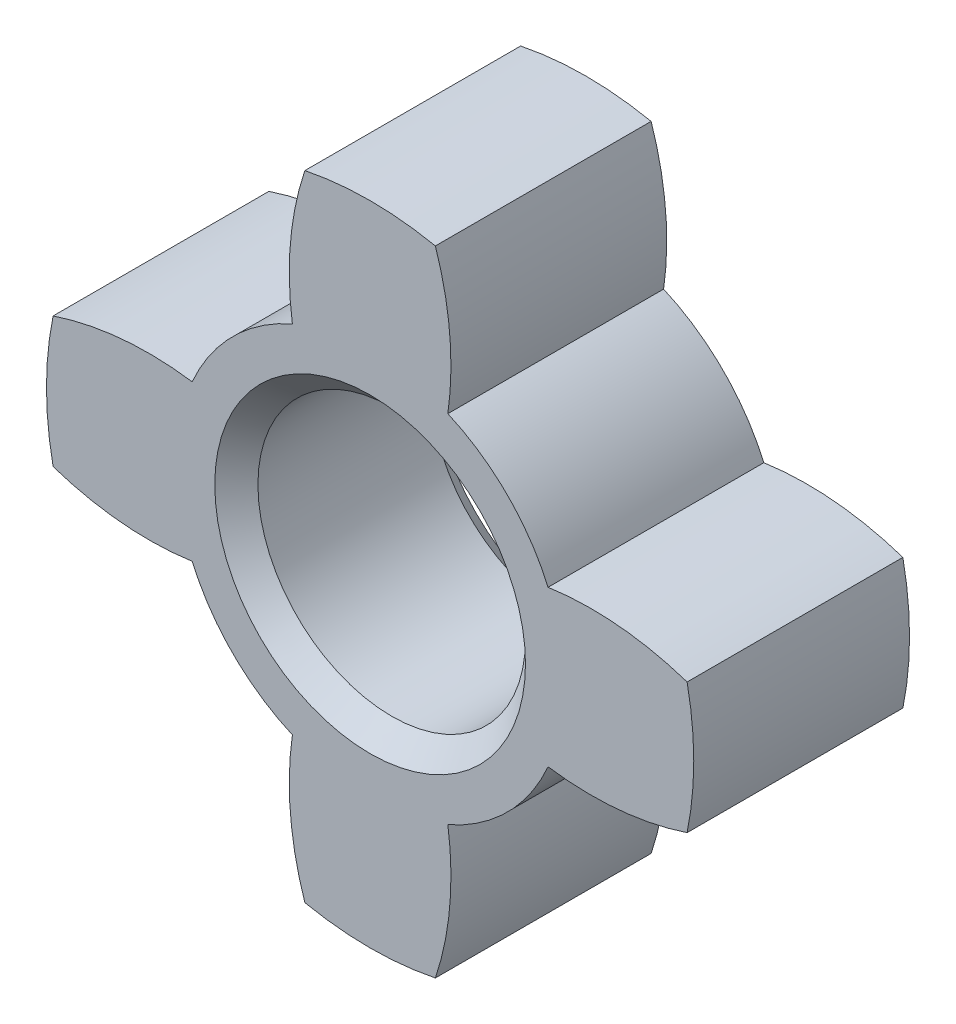
ISO-10303-21;
HEADER;
FILE_DESCRIPTION(('STEP AP214'),'2;1');
FILE_NAME('part.step','',(''),(''),'','','');
FILE_SCHEMA(('AUTOMOTIVE_DESIGN { 1 0 10303 214 1 1 1 1 }'));
ENDSEC;
DATA;
#1=APPLICATION_CONTEXT('core data for automotive mechanical design processes');
#2=APPLICATION_PROTOCOL_DEFINITION('international standard','automotive_design',2000,#1);
#3=PRODUCT_CONTEXT('',#1,'mechanical');
#4=PRODUCT('Part','Part','',(#3));
#5=PRODUCT_RELATED_PRODUCT_CATEGORY('part','',(#4));
#6=PRODUCT_DEFINITION_FORMATION('','',#4);
#7=PRODUCT_DEFINITION_CONTEXT('part definition',#1,'design');
#8=PRODUCT_DEFINITION('design','',#6,#7);
#9=PRODUCT_DEFINITION_SHAPE('','',#8);
#10=(LENGTH_UNIT() NAMED_UNIT(*) SI_UNIT(.MILLI.,.METRE.));
#11=(NAMED_UNIT(*) PLANE_ANGLE_UNIT() SI_UNIT($,.RADIAN.));
#12=(NAMED_UNIT(*) SI_UNIT($,.STERADIAN.) SOLID_ANGLE_UNIT());
#13=UNCERTAINTY_MEASURE_WITH_UNIT(LENGTH_MEASURE(1.E-05),#10,'distance_accuracy_value','');
#14=(GEOMETRIC_REPRESENTATION_CONTEXT(3) GLOBAL_UNCERTAINTY_ASSIGNED_CONTEXT((#13)) GLOBAL_UNIT_ASSIGNED_CONTEXT((#10,
#11,#12)) REPRESENTATION_CONTEXT('',''));
#15=CARTESIAN_POINT('',(0.,0.,0.));
#16=DIRECTION('',(0.,0.,1.));
#17=DIRECTION('',(1.,0.,0.));
#18=AXIS2_PLACEMENT_3D('',#15,#16,#17);
#19=CARTESIAN_POINT('',(0.,0.,0.));
#20=DIRECTION('',(0.,0.,1.));
#21=DIRECTION('',(1.,0.,0.));
#22=AXIS2_PLACEMENT_3D('',#19,#20,#21);
#23=CYLINDRICAL_SURFACE('',#22,7.5);
#24=CARTESIAN_POINT('',(0.,0.,5.));
#25=DIRECTION('',(0.,0.,1.));
#26=DIRECTION('',(1.,0.,0.));
#27=AXIS2_PLACEMENT_3D('',#24,#25,#26);
#28=CIRCLE('',#27,7.5);
#29=CARTESIAN_POINT('',(-7.34594490152616,1.5123139567371,5.));
#30=VERTEX_POINT('',#29);
#31=CARTESIAN_POINT('',(-7.34594490152616,-1.51231395673711,5.));
#32=VERTEX_POINT('',#31);
#33=EDGE_CURVE('E173',#30,#32,#28,.T.);
#34=ORIENTED_EDGE('',*,*,#33,.F.);
#35=DIRECTION('',(0.,0.,-1.));
#36=VECTOR('',#35,1.);
#37=CARTESIAN_POINT('',(-7.34594490152616,1.5123139567371,2.5));
#38=LINE('',#37,#36);
#39=CARTESIAN_POINT('',(-7.34594490152616,1.5123139567371,0.));
#40=VERTEX_POINT('',#39);
#41=EDGE_CURVE('E252',#30,#40,#38,.T.);
#42=ORIENTED_EDGE('',*,*,#41,.T.);
#43=CARTESIAN_POINT('',(0.,0.,0.));
#44=DIRECTION('',(0.,0.,1.));
#45=DIRECTION('',(1.,0.,0.));
#46=AXIS2_PLACEMENT_3D('',#43,#44,#45);
#47=CIRCLE('',#46,7.5);
#48=CARTESIAN_POINT('',(-7.34594490152616,-1.51231395673711,0.));
#49=VERTEX_POINT('',#48);
#50=EDGE_CURVE('E294',#40,#49,#47,.T.);
#51=ORIENTED_EDGE('',*,*,#50,.T.);
#52=DIRECTION('',(0.,0.,-1.));
#53=VECTOR('',#52,1.);
#54=CARTESIAN_POINT('',(-7.34594490152616,-1.51231395673712,2.5));
#55=LINE('',#54,#53);
#56=EDGE_CURVE('E250',#49,#32,#55,.F.);
#57=ORIENTED_EDGE('',*,*,#56,.T.);
#58=EDGE_LOOP('',(#34,#42,#51,#57));
#59=FACE_BOUND('',#58,.T.);
#60=ADVANCED_FACE('F39',(#59),#23,.T.);
#61=CARTESIAN_POINT('',(-1.51231395673728,-7.34594490152612,5.));
#62=VERTEX_POINT('',#61);
#63=CARTESIAN_POINT('',(1.51231395673729,-7.34594490152612,5.));
#64=VERTEX_POINT('',#63);
#65=EDGE_CURVE('E275',#62,#64,#28,.T.);
#66=ORIENTED_EDGE('',*,*,#65,.F.);
#67=DIRECTION('',(0.,0.,-1.));
#68=VECTOR('',#67,1.);
#69=CARTESIAN_POINT('',(-1.51231395673728,-7.34594490152612,2.5));
#70=LINE('',#69,#68);
#71=CARTESIAN_POINT('',(-1.51231395673728,-7.34594490152612,0.));
#72=VERTEX_POINT('',#71);
#73=EDGE_CURVE('E247',#62,#72,#70,.T.);
#74=ORIENTED_EDGE('',*,*,#73,.T.);
#75=CARTESIAN_POINT('',(1.51231395673729,-7.34594490152612,0.));
#76=VERTEX_POINT('',#75);
#77=EDGE_CURVE('E258',#72,#76,#47,.T.);
#78=ORIENTED_EDGE('',*,*,#77,.T.);
#79=DIRECTION('',(0.,0.,-1.));
#80=VECTOR('',#79,1.);
#81=CARTESIAN_POINT('',(1.51231395673729,-7.34594490152612,2.5));
#82=LINE('',#81,#80);
#83=EDGE_CURVE('E244',#76,#64,#82,.F.);
#84=ORIENTED_EDGE('',*,*,#83,.T.);
#85=EDGE_LOOP('',(#66,#74,#78,#84));
#86=FACE_BOUND('',#85,.T.);
#87=ADVANCED_FACE('F292',(#86),#23,.T.);
#88=CARTESIAN_POINT('',(7.34594490152615,-1.51231395673714,5.));
#89=VERTEX_POINT('',#88);
#90=CARTESIAN_POINT('',(7.34594490152616,1.5123139567371,5.));
#91=VERTEX_POINT('',#90);
#92=EDGE_CURVE('E272',#89,#91,#28,.T.);
#93=ORIENTED_EDGE('',*,*,#92,.F.);
#94=DIRECTION('',(0.,0.,-1.));
#95=VECTOR('',#94,1.);
#96=CARTESIAN_POINT('',(7.34594490152615,-1.51231395673714,2.5));
#97=LINE('',#96,#95);
#98=CARTESIAN_POINT('',(7.34594490152615,-1.51231395673714,0.));
#99=VERTEX_POINT('',#98);
#100=EDGE_CURVE('E241',#89,#99,#97,.T.);
#101=ORIENTED_EDGE('',*,*,#100,.T.);
#102=CARTESIAN_POINT('',(7.34594490152616,1.5123139567371,0.));
#103=VERTEX_POINT('',#102);
#104=EDGE_CURVE('E255',#99,#103,#47,.T.);
#105=ORIENTED_EDGE('',*,*,#104,.T.);
#106=DIRECTION('',(0.,0.,-1.));
#107=VECTOR('',#106,1.);
#108=CARTESIAN_POINT('',(7.34594490152616,1.5123139567371,2.5));
#109=LINE('',#108,#107);
#110=EDGE_CURVE('E238',#103,#91,#109,.F.);
#111=ORIENTED_EDGE('',*,*,#110,.T.);
#112=EDGE_LOOP('',(#93,#101,#105,#111));
#113=FACE_BOUND('',#112,.T.);
#114=ADVANCED_FACE('F321',(#113),#23,.T.);
#115=CARTESIAN_POINT('',(0.,7.5,5.));
#116=DIRECTION('',(0.,0.,-1.));
#117=DIRECTION('',(-1.,0.,0.));
#118=AXIS2_PLACEMENT_3D('',#115,#116,#117);
#119=PLANE('',#118);
#120=CARTESIAN_POINT('',(0.,0.,5.));
#121=DIRECTION('',(0.,0.,1.));
#122=DIRECTION('',(1.,0.,0.));
#123=AXIS2_PLACEMENT_3D('',#120,#121,#122);
#124=CIRCLE('',#123,3.6);
#125=CARTESIAN_POINT('',(3.6,0.,5.));
#126=VERTEX_POINT('',#125);
#127=EDGE_CURVE('E269',#126,#126,#124,.T.);
#128=ORIENTED_EDGE('',*,*,#127,.F.);
#129=EDGE_LOOP('',(#128));
#130=FACE_BOUND('',#129,.T.);
#131=ORIENTED_EDGE('',*,*,#33,.T.);
#132=CARTESIAN_POINT('',(-5.12652416360278,5.12652416360271,5.));
#133=DIRECTION('',(0.,0.,1.));
#134=DIRECTION('',(1.,0.,0.));
#135=AXIS2_PLACEMENT_3D('',#132,#133,#134);
#136=CIRCLE('',#135,7.00000000000011);
#137=CARTESIAN_POINT('',(-4.12375948834092,-1.80127945702977,5.));
#138=VERTEX_POINT('',#137);
#139=EDGE_CURVE('E156',#32,#138,#136,.T.);
#140=ORIENTED_EDGE('',*,*,#139,.T.);
#141=CARTESIAN_POINT('',(0.,0.,5.));
#142=DIRECTION('',(0.,0.,1.));
#143=DIRECTION('',(1.,0.,0.));
#144=AXIS2_PLACEMENT_3D('',#141,#142,#143);
#145=CIRCLE('',#144,4.49999999999995);
#146=CARTESIAN_POINT('',(-1.8012794570299,-4.1237594883409,5.));
#147=VERTEX_POINT('',#146);
#148=EDGE_CURVE('E162',#138,#147,#145,.T.);
#149=ORIENTED_EDGE('',*,*,#148,.T.);
#150=CARTESIAN_POINT('',(5.12652416360271,-5.12652416360278,5.));
#151=DIRECTION('',(0.,0.,1.));
#152=DIRECTION('',(1.,0.,0.));
#153=AXIS2_PLACEMENT_3D('',#150,#151,#152);
#154=CIRCLE('',#153,7.00000000000026);
#155=EDGE_CURVE('E167',#147,#62,#154,.T.);
#156=ORIENTED_EDGE('',*,*,#155,.T.);
#157=ORIENTED_EDGE('',*,*,#65,.T.);
#158=CARTESIAN_POINT('',(-5.12652416360235,-5.12652416360258,5.));
#159=DIRECTION('',(0.,0.,1.));
#160=DIRECTION('',(1.,0.,0.));
#161=AXIS2_PLACEMENT_3D('',#158,#159,#160);
#162=CIRCLE('',#161,6.99999999999998);
#163=CARTESIAN_POINT('',(1.80127945703003,-4.12375948834088,5.));
#164=VERTEX_POINT('',#163);
#165=EDGE_CURVE('E180',#64,#164,#162,.T.);
#166=ORIENTED_EDGE('',*,*,#165,.T.);
#167=CARTESIAN_POINT('',(0.,0.,5.));
#168=DIRECTION('',(0.,0.,1.));
#169=DIRECTION('',(1.,0.,0.));
#170=AXIS2_PLACEMENT_3D('',#167,#168,#169);
#171=CIRCLE('',#170,4.49999999999995);
#172=CARTESIAN_POINT('',(4.1237594883409,-1.8012794570299,5.));
#173=VERTEX_POINT('',#172);
#174=EDGE_CURVE('E183',#164,#173,#171,.T.);
#175=ORIENTED_EDGE('',*,*,#174,.T.);
#176=CARTESIAN_POINT('',(5.12652416360258,5.12652416360235,5.));
#177=DIRECTION('',(0.,0.,1.));
#178=DIRECTION('',(1.,0.,0.));
#179=AXIS2_PLACEMENT_3D('',#176,#177,#178);
#180=CIRCLE('',#179,6.99999999999985);
#181=EDGE_CURVE('E186',#173,#89,#180,.T.);
#182=ORIENTED_EDGE('',*,*,#181,.T.);
#183=ORIENTED_EDGE('',*,*,#92,.T.);
#184=CARTESIAN_POINT('',(5.12652416360271,-5.12652416360278,5.));
#185=DIRECTION('',(0.,0.,1.));
#186=DIRECTION('',(1.,0.,0.));
#187=AXIS2_PLACEMENT_3D('',#184,#185,#186);
#188=CIRCLE('',#187,7.00000000000019);
#189=CARTESIAN_POINT('',(4.12375948834092,1.80127945702979,5.));
#190=VERTEX_POINT('',#189);
#191=EDGE_CURVE('E189',#91,#190,#188,.T.);
#192=ORIENTED_EDGE('',*,*,#191,.T.);
#193=CARTESIAN_POINT('',(0.,0.,5.));
#194=DIRECTION('',(0.,0.,1.));
#195=DIRECTION('',(1.,0.,0.));
#196=AXIS2_PLACEMENT_3D('',#193,#194,#195);
#197=CIRCLE('',#196,4.49999999999995);
#198=CARTESIAN_POINT('',(1.8012794570299,4.1237594883409,5.));
#199=VERTEX_POINT('',#198);
#200=EDGE_CURVE('E192',#190,#199,#197,.T.);
#201=ORIENTED_EDGE('',*,*,#200,.T.);
#202=CARTESIAN_POINT('',(-5.12652416360278,5.12652416360271,5.));
#203=DIRECTION('',(0.,0.,1.));
#204=DIRECTION('',(1.,0.,0.));
#205=AXIS2_PLACEMENT_3D('',#202,#203,#204);
#206=CIRCLE('',#205,7.00000000000019);
#207=CARTESIAN_POINT('',(1.5123139567371,7.34594490152616,5.));
#208=VERTEX_POINT('',#207);
#209=EDGE_CURVE('E195',#199,#208,#206,.T.);
#210=ORIENTED_EDGE('',*,*,#209,.T.);
#211=CARTESIAN_POINT('',(-1.5123139567371,7.34594490152616,5.));
#212=VERTEX_POINT('',#211);
#213=EDGE_CURVE('E276',#208,#212,#28,.T.);
#214=ORIENTED_EDGE('',*,*,#213,.T.);
#215=CARTESIAN_POINT('',(5.12652416360258,5.12652416360235,5.));
#216=DIRECTION('',(0.,0.,1.));
#217=DIRECTION('',(1.,0.,0.));
#218=AXIS2_PLACEMENT_3D('',#215,#216,#217);
#219=CIRCLE('',#218,7.00000000000012);
#220=CARTESIAN_POINT('',(-1.80127945702996,4.12375948834088,5.));
#221=VERTEX_POINT('',#220);
#222=EDGE_CURVE('E198',#212,#221,#219,.T.);
#223=ORIENTED_EDGE('',*,*,#222,.T.);
#224=CARTESIAN_POINT('',(0.,0.,5.));
#225=DIRECTION('',(0.,0.,1.));
#226=DIRECTION('',(1.,0.,0.));
#227=AXIS2_PLACEMENT_3D('',#224,#225,#226);
#228=CIRCLE('',#227,4.49999999999995);
#229=CARTESIAN_POINT('',(-4.1237594883409,1.8012794570299,5.));
#230=VERTEX_POINT('',#229);
#231=EDGE_CURVE('E201',#221,#230,#228,.T.);
#232=ORIENTED_EDGE('',*,*,#231,.T.);
#233=CARTESIAN_POINT('',(-5.12652416360235,-5.12652416360258,5.));
#234=DIRECTION('',(0.,0.,1.));
#235=DIRECTION('',(1.,0.,0.));
#236=AXIS2_PLACEMENT_3D('',#233,#234,#235);
#237=CIRCLE('',#236,7.00000000000011);
#238=EDGE_CURVE('E174',#230,#30,#237,.T.);
#239=ORIENTED_EDGE('',*,*,#238,.T.);
#240=EDGE_LOOP('',(#131,#140,#149,#156,#157,#166,#175,#182,#183,#192,#201,#210,#214,#223,#232,#239));
#241=FACE_BOUND('',#240,.T.);
#242=ADVANCED_FACE('F170',(#130,#241),#119,.F.);
#243=CARTESIAN_POINT('',(0.,3.6,0.));
#244=DIRECTION('',(0.,0.,1.));
#245=DIRECTION('',(1.,0.,0.));
#246=AXIS2_PLACEMENT_3D('',#243,#244,#245);
#247=PLANE('',#246);
#248=CARTESIAN_POINT('',(0.,0.,0.));
#249=DIRECTION('',(0.,0.,1.));
#250=DIRECTION('',(1.,0.,0.));
#251=AXIS2_PLACEMENT_3D('',#248,#249,#250);
#252=CIRCLE('',#251,3.6);
#253=CARTESIAN_POINT('',(3.6,0.,0.));
#254=VERTEX_POINT('',#253);
#255=EDGE_CURVE('E260',#254,#254,#252,.T.);
#256=ORIENTED_EDGE('',*,*,#255,.T.);
#257=EDGE_LOOP('',(#256));
#258=FACE_BOUND('',#257,.T.);
#259=CARTESIAN_POINT('',(0.,0.,0.));
#260=DIRECTION('',(0.,0.,1.));
#261=DIRECTION('',(1.,0.,0.));
#262=AXIS2_PLACEMENT_3D('',#259,#260,#261);
#263=CIRCLE('',#262,4.49999999999995);
#264=CARTESIAN_POINT('',(-4.12375948834092,-1.80127945702977,0.));
#265=VERTEX_POINT('',#264);
#266=CARTESIAN_POINT('',(-1.80127945702992,-4.1237594883409,0.));
#267=VERTEX_POINT('',#266);
#268=EDGE_CURVE('E54',#265,#267,#263,.T.);
#269=ORIENTED_EDGE('',*,*,#268,.F.);
#270=CARTESIAN_POINT('',(-5.12652416360278,5.12652416360271,0.));
#271=DIRECTION('',(0.,0.,1.));
#272=DIRECTION('',(1.,0.,0.));
#273=AXIS2_PLACEMENT_3D('',#270,#271,#272);
#274=CIRCLE('',#273,7.00000000000011);
#275=EDGE_CURVE('E11',#265,#49,#274,.F.);
#276=ORIENTED_EDGE('',*,*,#275,.T.);
#277=ORIENTED_EDGE('',*,*,#50,.F.);
#278=CARTESIAN_POINT('',(-5.12652416360235,-5.12652416360258,0.));
#279=DIRECTION('',(0.,0.,1.));
#280=DIRECTION('',(1.,0.,0.));
#281=AXIS2_PLACEMENT_3D('',#278,#279,#280);
#282=CIRCLE('',#281,7.00000000000011);
#283=CARTESIAN_POINT('',(-4.1237594883409,1.8012794570299,0.));
#284=VERTEX_POINT('',#283);
#285=EDGE_CURVE('E205',#284,#40,#282,.T.);
#286=ORIENTED_EDGE('',*,*,#285,.F.);
#287=CARTESIAN_POINT('',(0.,0.,0.));
#288=DIRECTION('',(0.,0.,1.));
#289=DIRECTION('',(1.,0.,0.));
#290=AXIS2_PLACEMENT_3D('',#287,#288,#289);
#291=CIRCLE('',#290,4.49999999999995);
#292=CARTESIAN_POINT('',(-1.80127945702996,4.12375948834088,0.));
#293=VERTEX_POINT('',#292);
#294=EDGE_CURVE('E176',#293,#284,#291,.T.);
#295=ORIENTED_EDGE('',*,*,#294,.F.);
#296=CARTESIAN_POINT('',(5.12652416360258,5.12652416360235,0.));
#297=DIRECTION('',(0.,0.,1.));
#298=DIRECTION('',(1.,0.,0.));
#299=AXIS2_PLACEMENT_3D('',#296,#297,#298);
#300=CIRCLE('',#299,7.00000000000012);
#301=CARTESIAN_POINT('',(-1.5123139567371,7.34594490152616,0.));
#302=VERTEX_POINT('',#301);
#303=EDGE_CURVE('E277',#293,#302,#300,.F.);
#304=ORIENTED_EDGE('',*,*,#303,.T.);
#305=CARTESIAN_POINT('',(1.5123139567371,7.34594490152616,0.));
#306=VERTEX_POINT('',#305);
#307=EDGE_CURVE('E259',#306,#302,#47,.T.);
#308=ORIENTED_EDGE('',*,*,#307,.F.);
#309=CARTESIAN_POINT('',(-5.12652416360278,5.12652416360271,0.));
#310=DIRECTION('',(0.,0.,1.));
#311=DIRECTION('',(1.,0.,0.));
#312=AXIS2_PLACEMENT_3D('',#309,#310,#311);
#313=CIRCLE('',#312,7.00000000000019);
#314=CARTESIAN_POINT('',(1.80127945702979,4.12375948834092,0.));
#315=VERTEX_POINT('',#314);
#316=EDGE_CURVE('E215',#315,#306,#313,.T.);
#317=ORIENTED_EDGE('',*,*,#316,.F.);
#318=CARTESIAN_POINT('',(0.,0.,0.));
#319=DIRECTION('',(0.,0.,1.));
#320=DIRECTION('',(1.,0.,0.));
#321=AXIS2_PLACEMENT_3D('',#318,#319,#320);
#322=CIRCLE('',#321,4.49999999999995);
#323=CARTESIAN_POINT('',(4.12375948834092,1.80127945702979,0.));
#324=VERTEX_POINT('',#323);
#325=EDGE_CURVE('E213',#324,#315,#322,.T.);
#326=ORIENTED_EDGE('',*,*,#325,.F.);
#327=CARTESIAN_POINT('',(5.12652416360271,-5.12652416360278,0.));
#328=DIRECTION('',(0.,0.,1.));
#329=DIRECTION('',(1.,0.,0.));
#330=AXIS2_PLACEMENT_3D('',#327,#328,#329);
#331=CIRCLE('',#330,7.00000000000019);
#332=EDGE_CURVE('E280',#324,#103,#331,.F.);
#333=ORIENTED_EDGE('',*,*,#332,.T.);
#334=ORIENTED_EDGE('',*,*,#104,.F.);
#335=CARTESIAN_POINT('',(5.12652416360258,5.12652416360235,0.));
#336=DIRECTION('',(0.,0.,1.));
#337=DIRECTION('',(1.,0.,0.));
#338=AXIS2_PLACEMENT_3D('',#335,#336,#337);
#339=CIRCLE('',#338,6.99999999999985);
#340=CARTESIAN_POINT('',(4.1237594883409,-1.8012794570299,0.));
#341=VERTEX_POINT('',#340);
#342=EDGE_CURVE('E211',#341,#99,#339,.T.);
#343=ORIENTED_EDGE('',*,*,#342,.F.);
#344=CARTESIAN_POINT('',(0.,0.,0.));
#345=DIRECTION('',(0.,0.,1.));
#346=DIRECTION('',(1.,0.,0.));
#347=AXIS2_PLACEMENT_3D('',#344,#345,#346);
#348=CIRCLE('',#347,4.49999999999995);
#349=CARTESIAN_POINT('',(1.80127945703003,-4.12375948834088,0.));
#350=VERTEX_POINT('',#349);
#351=EDGE_CURVE('E62',#350,#341,#348,.T.);
#352=ORIENTED_EDGE('',*,*,#351,.F.);
#353=CARTESIAN_POINT('',(-5.12652416360235,-5.12652416360258,0.));
#354=DIRECTION('',(0.,0.,1.));
#355=DIRECTION('',(1.,0.,0.));
#356=AXIS2_PLACEMENT_3D('',#353,#354,#355);
#357=CIRCLE('',#356,6.99999999999998);
#358=EDGE_CURVE('E47',#350,#76,#357,.F.);
#359=ORIENTED_EDGE('',*,*,#358,.T.);
#360=ORIENTED_EDGE('',*,*,#77,.F.);
#361=CARTESIAN_POINT('',(5.12652416360271,-5.12652416360278,0.));
#362=DIRECTION('',(0.,0.,1.));
#363=DIRECTION('',(1.,0.,0.));
#364=AXIS2_PLACEMENT_3D('',#361,#362,#363);
#365=CIRCLE('',#364,7.00000000000026);
#366=EDGE_CURVE('E208',#267,#72,#365,.T.);
#367=ORIENTED_EDGE('',*,*,#366,.F.);
#368=EDGE_LOOP('',(#269,#276,#277,#286,#295,#304,#308,#317,#326,#333,#334,#343,#352,#359,#360,#367));
#369=FACE_BOUND('',#368,.T.);
#370=ADVANCED_FACE('F286',(#258,#369),#247,.F.);
#371=ORIENTED_EDGE('',*,*,#213,.F.);
#372=DIRECTION('',(0.,0.,-1.));
#373=VECTOR('',#372,1.);
#374=CARTESIAN_POINT('',(1.5123139567371,7.34594490152616,2.5));
#375=LINE('',#374,#373);
#376=EDGE_CURVE('E235',#208,#306,#375,.T.);
#377=ORIENTED_EDGE('',*,*,#376,.T.);
#378=ORIENTED_EDGE('',*,*,#307,.T.);
#379=DIRECTION('',(0.,0.,-1.));
#380=VECTOR('',#379,1.);
#381=CARTESIAN_POINT('',(-1.5123139567371,7.34594490152616,2.5));
#382=LINE('',#381,#380);
#383=EDGE_CURVE('E158',#302,#212,#382,.F.);
#384=ORIENTED_EDGE('',*,*,#383,.T.);
#385=EDGE_LOOP('',(#371,#377,#378,#384));
#386=FACE_BOUND('',#385,.T.);
#387=ADVANCED_FACE('F41',(#386),#23,.T.);
#388=CARTESIAN_POINT('',(0.,0.,5.));
#389=DIRECTION('',(0.,0.,1.));
#390=DIRECTION('',(1.,0.,0.));
#391=AXIS2_PLACEMENT_3D('',#388,#389,#390);
#392=CONICAL_SURFACE('',#391,3.6,0.785398163397449);
#393=CARTESIAN_POINT('',(0.,0.,4.5));
#394=DIRECTION('',(0.,0.,1.));
#395=DIRECTION('',(1.,0.,0.));
#396=AXIS2_PLACEMENT_3D('',#393,#394,#395);
#397=CIRCLE('',#396,3.1);
#398=CARTESIAN_POINT('',(3.1,0.,4.5));
#399=VERTEX_POINT('',#398);
#400=EDGE_CURVE('E266',#399,#399,#397,.T.);
#401=ORIENTED_EDGE('',*,*,#400,.F.);
#402=EDGE_LOOP('',(#401));
#403=FACE_BOUND('',#402,.T.);
#404=ORIENTED_EDGE('',*,*,#127,.T.);
#405=EDGE_LOOP('',(#404));
#406=FACE_BOUND('',#405,.T.);
#407=ADVANCED_FACE('F323',(#403,#406),#392,.F.);
#408=CARTESIAN_POINT('',(0.,0.,0.));
#409=DIRECTION('',(0.,0.,1.));
#410=DIRECTION('',(1.,0.,0.));
#411=AXIS2_PLACEMENT_3D('',#408,#409,#410);
#412=CYLINDRICAL_SURFACE('',#411,3.1);
#413=CARTESIAN_POINT('',(0.,0.,0.5));
#414=DIRECTION('',(0.,0.,1.));
#415=DIRECTION('',(1.,0.,0.));
#416=AXIS2_PLACEMENT_3D('',#413,#414,#415);
#417=CIRCLE('',#416,3.1);
#418=CARTESIAN_POINT('',(3.1,0.,0.5));
#419=VERTEX_POINT('',#418);
#420=EDGE_CURVE('E263',#419,#419,#417,.T.);
#421=ORIENTED_EDGE('',*,*,#420,.F.);
#422=EDGE_LOOP('',(#421));
#423=FACE_BOUND('',#422,.T.);
#424=ORIENTED_EDGE('',*,*,#400,.T.);
#425=EDGE_LOOP('',(#424));
#426=FACE_BOUND('',#425,.T.);
#427=ADVANCED_FACE('F328',(#423,#426),#412,.F.);
#428=CARTESIAN_POINT('',(0.,0.,0.5));
#429=DIRECTION('',(0.,0.,-1.));
#430=DIRECTION('',(-1.,0.,0.));
#431=AXIS2_PLACEMENT_3D('',#428,#429,#430);
#432=CONICAL_SURFACE('',#431,3.1,0.785398163397448);
#433=ORIENTED_EDGE('',*,*,#255,.F.);
#434=EDGE_LOOP('',(#433));
#435=FACE_BOUND('',#434,.T.);
#436=ORIENTED_EDGE('',*,*,#420,.T.);
#437=EDGE_LOOP('',(#436));
#438=FACE_BOUND('',#437,.T.);
#439=ADVANCED_FACE('F379',(#435,#438),#432,.F.);
#440=CARTESIAN_POINT('',(0.,0.,5.));
#441=DIRECTION('',(0.,0.,-1.));
#442=DIRECTION('',(-1.,0.,0.));
#443=AXIS2_PLACEMENT_3D('',#440,#441,#442);
#444=CYLINDRICAL_SURFACE('',#443,4.49999999999995);
#445=ORIENTED_EDGE('',*,*,#294,.T.);
#446=DIRECTION('',(0.,0.,-1.));
#447=VECTOR('',#446,1.);
#448=CARTESIAN_POINT('',(-4.1237594883409,1.8012794570299,5.));
#449=LINE('',#448,#447);
#450=EDGE_CURVE('E204',#230,#284,#449,.T.);
#451=ORIENTED_EDGE('',*,*,#450,.F.);
#452=ORIENTED_EDGE('',*,*,#231,.F.);
#453=DIRECTION('',(0.,0.,-1.));
#454=VECTOR('',#453,1.);
#455=CARTESIAN_POINT('',(-1.80127945702997,4.12375948834089,5.));
#456=LINE('',#455,#454);
#457=EDGE_CURVE('E220',#221,#293,#456,.T.);
#458=ORIENTED_EDGE('',*,*,#457,.T.);
#459=EDGE_LOOP('',(#445,#451,#452,#458));
#460=FACE_BOUND('',#459,.T.);
#461=ADVANCED_FACE('F382',(#460),#444,.T.);
#462=CARTESIAN_POINT('',(5.12652416360258,5.12652416360235,5.));
#463=DIRECTION('',(0.,0.,-1.));
#464=DIRECTION('',(-1.,0.,0.));
#465=AXIS2_PLACEMENT_3D('',#462,#463,#464);
#466=CYLINDRICAL_SURFACE('',#465,7.00000000000012);
#467=ORIENTED_EDGE('',*,*,#303,.F.);
#468=ORIENTED_EDGE('',*,*,#457,.F.);
#469=ORIENTED_EDGE('',*,*,#222,.F.);
#470=ORIENTED_EDGE('',*,*,#383,.F.);
#471=EDGE_LOOP('',(#467,#468,#469,#470));
#472=FACE_BOUND('',#471,.T.);
#473=ADVANCED_FACE('F309',(#472),#466,.T.);
#474=CARTESIAN_POINT('',(-5.12652416360235,-5.12652416360258,5.));
#475=DIRECTION('',(0.,0.,-1.));
#476=DIRECTION('',(-1.,0.,0.));
#477=AXIS2_PLACEMENT_3D('',#474,#475,#476);
#478=CYLINDRICAL_SURFACE('',#477,7.00000000000011);
#479=ORIENTED_EDGE('',*,*,#238,.F.);
#480=ORIENTED_EDGE('',*,*,#450,.T.);
#481=ORIENTED_EDGE('',*,*,#285,.T.);
#482=ORIENTED_EDGE('',*,*,#41,.F.);
#483=EDGE_LOOP('',(#479,#480,#481,#482));
#484=FACE_BOUND('',#483,.T.);
#485=ADVANCED_FACE('F316',(#484),#478,.T.);
#486=CARTESIAN_POINT('',(-5.12652416360278,5.12652416360271,5.));
#487=DIRECTION('',(0.,0.,-1.));
#488=DIRECTION('',(-1.,0.,0.));
#489=AXIS2_PLACEMENT_3D('',#486,#487,#488);
#490=CYLINDRICAL_SURFACE('',#489,7.00000000000019);
#491=ORIENTED_EDGE('',*,*,#209,.F.);
#492=DIRECTION('',(0.,0.,-1.));
#493=VECTOR('',#492,1.);
#494=CARTESIAN_POINT('',(1.8012794570299,4.1237594883409,5.));
#495=LINE('',#494,#493);
#496=EDGE_CURVE('E222',#199,#315,#495,.T.);
#497=ORIENTED_EDGE('',*,*,#496,.T.);
#498=ORIENTED_EDGE('',*,*,#316,.T.);
#499=ORIENTED_EDGE('',*,*,#376,.F.);
#500=EDGE_LOOP('',(#491,#497,#498,#499));
#501=FACE_BOUND('',#500,.T.);
#502=ADVANCED_FACE('F351',(#501),#490,.T.);
#503=CARTESIAN_POINT('',(0.,0.,5.));
#504=DIRECTION('',(0.,0.,-1.));
#505=DIRECTION('',(-1.,0.,0.));
#506=AXIS2_PLACEMENT_3D('',#503,#504,#505);
#507=CYLINDRICAL_SURFACE('',#506,4.49999999999995);
#508=ORIENTED_EDGE('',*,*,#325,.T.);
#509=ORIENTED_EDGE('',*,*,#496,.F.);
#510=ORIENTED_EDGE('',*,*,#200,.F.);
#511=DIRECTION('',(0.,0.,-1.));
#512=VECTOR('',#511,1.);
#513=CARTESIAN_POINT('',(4.12375948834092,1.80127945702979,5.));
#514=LINE('',#513,#512);
#515=EDGE_CURVE('E225',#190,#324,#514,.T.);
#516=ORIENTED_EDGE('',*,*,#515,.T.);
#517=EDGE_LOOP('',(#508,#509,#510,#516));
#518=FACE_BOUND('',#517,.T.);
#519=ADVANCED_FACE('F349',(#518),#507,.T.);
#520=CARTESIAN_POINT('',(5.12652416360271,-5.12652416360278,5.));
#521=DIRECTION('',(0.,0.,-1.));
#522=DIRECTION('',(-1.,0.,0.));
#523=AXIS2_PLACEMENT_3D('',#520,#521,#522);
#524=CYLINDRICAL_SURFACE('',#523,7.00000000000019);
#525=ORIENTED_EDGE('',*,*,#332,.F.);
#526=ORIENTED_EDGE('',*,*,#515,.F.);
#527=ORIENTED_EDGE('',*,*,#191,.F.);
#528=ORIENTED_EDGE('',*,*,#110,.F.);
#529=EDGE_LOOP('',(#525,#526,#527,#528));
#530=FACE_BOUND('',#529,.T.);
#531=ADVANCED_FACE('F346',(#530),#524,.T.);
#532=CARTESIAN_POINT('',(5.12652416360258,5.12652416360235,5.));
#533=DIRECTION('',(0.,0.,-1.));
#534=DIRECTION('',(-1.,0.,0.));
#535=AXIS2_PLACEMENT_3D('',#532,#533,#534);
#536=CYLINDRICAL_SURFACE('',#535,6.99999999999985);
#537=ORIENTED_EDGE('',*,*,#181,.F.);
#538=DIRECTION('',(0.,0.,-1.));
#539=VECTOR('',#538,1.);
#540=CARTESIAN_POINT('',(4.1237594883409,-1.8012794570299,5.));
#541=LINE('',#540,#539);
#542=EDGE_CURVE('E228',#173,#341,#541,.T.);
#543=ORIENTED_EDGE('',*,*,#542,.T.);
#544=ORIENTED_EDGE('',*,*,#342,.T.);
#545=ORIENTED_EDGE('',*,*,#100,.F.);
#546=EDGE_LOOP('',(#537,#543,#544,#545));
#547=FACE_BOUND('',#546,.T.);
#548=ADVANCED_FACE('F344',(#547),#536,.T.);
#549=CARTESIAN_POINT('',(0.,0.,5.));
#550=DIRECTION('',(0.,0.,-1.));
#551=DIRECTION('',(-1.,0.,0.));
#552=AXIS2_PLACEMENT_3D('',#549,#550,#551);
#553=CYLINDRICAL_SURFACE('',#552,4.49999999999995);
#554=ORIENTED_EDGE('',*,*,#351,.T.);
#555=ORIENTED_EDGE('',*,*,#542,.F.);
#556=ORIENTED_EDGE('',*,*,#174,.F.);
#557=DIRECTION('',(0.,0.,-1.));
#558=VECTOR('',#557,1.);
#559=CARTESIAN_POINT('',(1.80127945703003,-4.12375948834088,5.));
#560=LINE('',#559,#558);
#561=EDGE_CURVE('E230',#164,#350,#560,.T.);
#562=ORIENTED_EDGE('',*,*,#561,.T.);
#563=EDGE_LOOP('',(#554,#555,#556,#562));
#564=FACE_BOUND('',#563,.T.);
#565=ADVANCED_FACE('F367',(#564),#553,.T.);
#566=CARTESIAN_POINT('',(-5.12652416360235,-5.12652416360258,5.));
#567=DIRECTION('',(0.,0.,-1.));
#568=DIRECTION('',(-1.,0.,0.));
#569=AXIS2_PLACEMENT_3D('',#566,#567,#568);
#570=CYLINDRICAL_SURFACE('',#569,6.99999999999998);
#571=ORIENTED_EDGE('',*,*,#358,.F.);
#572=ORIENTED_EDGE('',*,*,#561,.F.);
#573=ORIENTED_EDGE('',*,*,#165,.F.);
#574=ORIENTED_EDGE('',*,*,#83,.F.);
#575=EDGE_LOOP('',(#571,#572,#573,#574));
#576=FACE_BOUND('',#575,.T.);
#577=ADVANCED_FACE('F370',(#576),#570,.T.);
#578=CARTESIAN_POINT('',(-5.12652416360278,5.12652416360271,5.));
#579=DIRECTION('',(0.,0.,-1.));
#580=DIRECTION('',(-1.,0.,0.));
#581=AXIS2_PLACEMENT_3D('',#578,#579,#580);
#582=CYLINDRICAL_SURFACE('',#581,7.00000000000011);
#583=ORIENTED_EDGE('',*,*,#275,.F.);
#584=DIRECTION('',(0.,0.,-1.));
#585=VECTOR('',#584,1.);
#586=CARTESIAN_POINT('',(-4.12375948834092,-1.80127945702977,5.));
#587=LINE('',#586,#585);
#588=EDGE_CURVE('E152',#138,#265,#587,.T.);
#589=ORIENTED_EDGE('',*,*,#588,.F.);
#590=ORIENTED_EDGE('',*,*,#139,.F.);
#591=ORIENTED_EDGE('',*,*,#56,.F.);
#592=EDGE_LOOP('',(#583,#589,#590,#591));
#593=FACE_BOUND('',#592,.T.);
#594=ADVANCED_FACE('F154',(#593),#582,.T.);
#595=CARTESIAN_POINT('',(5.12652416360271,-5.12652416360278,5.));
#596=DIRECTION('',(0.,0.,-1.));
#597=DIRECTION('',(-1.,0.,0.));
#598=AXIS2_PLACEMENT_3D('',#595,#596,#597);
#599=CYLINDRICAL_SURFACE('',#598,7.00000000000026);
#600=ORIENTED_EDGE('',*,*,#155,.F.);
#601=DIRECTION('',(0.,0.,-1.));
#602=VECTOR('',#601,1.);
#603=CARTESIAN_POINT('',(-1.8012794570299,-4.1237594883409,5.));
#604=LINE('',#603,#602);
#605=EDGE_CURVE('E159',#147,#267,#604,.T.);
#606=ORIENTED_EDGE('',*,*,#605,.T.);
#607=ORIENTED_EDGE('',*,*,#366,.T.);
#608=ORIENTED_EDGE('',*,*,#73,.F.);
#609=EDGE_LOOP('',(#600,#606,#607,#608));
#610=FACE_BOUND('',#609,.T.);
#611=ADVANCED_FACE('F313',(#610),#599,.T.);
#612=CARTESIAN_POINT('',(0.,0.,5.));
#613=DIRECTION('',(0.,0.,-1.));
#614=DIRECTION('',(-1.,0.,0.));
#615=AXIS2_PLACEMENT_3D('',#612,#613,#614);
#616=CYLINDRICAL_SURFACE('',#615,4.49999999999995);
#617=ORIENTED_EDGE('',*,*,#268,.T.);
#618=ORIENTED_EDGE('',*,*,#605,.F.);
#619=ORIENTED_EDGE('',*,*,#148,.F.);
#620=ORIENTED_EDGE('',*,*,#588,.T.);
#621=EDGE_LOOP('',(#617,#618,#619,#620));
#622=FACE_BOUND('',#621,.T.);
#623=ADVANCED_FACE('F163',(#622),#616,.T.);
#624=CLOSED_SHELL('',(#60,#87,#114,#242,#370,#387,#407,#427,#439,#461,#473,#485,#502,#519,#531,
#548,#565,#577,#594,#611,#623));
#625=MANIFOLD_SOLID_BREP('B2',#624);
#626=ADVANCED_BREP_SHAPE_REPRESENTATION('',(#18,#625),#14);
#627=SHAPE_DEFINITION_REPRESENTATION(#9,#626);
ENDSEC;
END-ISO-10303-21;
